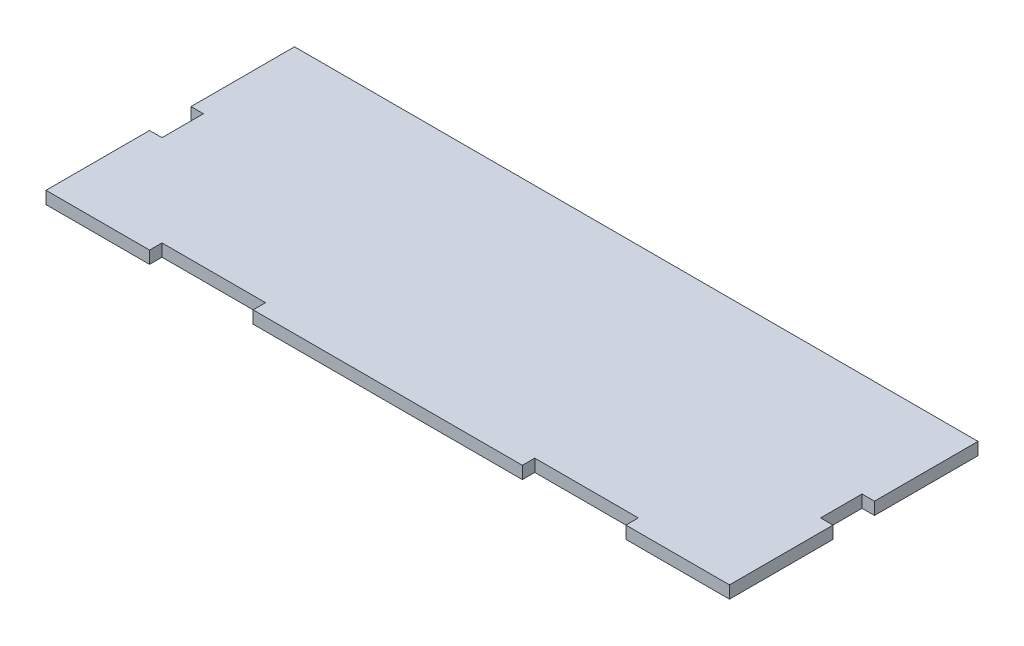
ISO-10303-21;
HEADER;
FILE_DESCRIPTION(('STEP AP214'),'2;1');
FILE_NAME('part.step','',(''),(''),'','','');
FILE_SCHEMA(('AUTOMOTIVE_DESIGN { 1 0 10303 214 1 1 1 1 }'));
ENDSEC;
DATA;
#1=APPLICATION_CONTEXT('core data for automotive mechanical design processes');
#2=APPLICATION_PROTOCOL_DEFINITION('international standard','automotive_design',2000,#1);
#3=PRODUCT_CONTEXT('',#1,'mechanical');
#4=PRODUCT('Part','Part','',(#3));
#5=PRODUCT_RELATED_PRODUCT_CATEGORY('part','',(#4));
#6=PRODUCT_DEFINITION_FORMATION('','',#4);
#7=PRODUCT_DEFINITION_CONTEXT('part definition',#1,'design');
#8=PRODUCT_DEFINITION('design','',#6,#7);
#9=PRODUCT_DEFINITION_SHAPE('','',#8);
#10=(LENGTH_UNIT() NAMED_UNIT(*) SI_UNIT(.MILLI.,.METRE.));
#11=(NAMED_UNIT(*) PLANE_ANGLE_UNIT() SI_UNIT($,.RADIAN.));
#12=(NAMED_UNIT(*) SI_UNIT($,.STERADIAN.) SOLID_ANGLE_UNIT());
#13=UNCERTAINTY_MEASURE_WITH_UNIT(LENGTH_MEASURE(1.E-05),#10,'distance_accuracy_value','');
#14=(GEOMETRIC_REPRESENTATION_CONTEXT(3) GLOBAL_UNCERTAINTY_ASSIGNED_CONTEXT((#13)) GLOBAL_UNIT_ASSIGNED_CONTEXT((#10,
#11,#12)) REPRESENTATION_CONTEXT('',''));
#15=CARTESIAN_POINT('',(0.,0.,0.));
#16=DIRECTION('',(0.,0.,1.));
#17=DIRECTION('',(1.,0.,0.));
#18=AXIS2_PLACEMENT_3D('',#15,#16,#17);
#19=CARTESIAN_POINT('',(82.5,3.,30.));
#20=DIRECTION('',(-1.,0.,0.));
#21=DIRECTION('',(0.,0.,1.));
#22=AXIS2_PLACEMENT_3D('',#19,#20,#21);
#23=PLANE('',#22);
#24=DIRECTION('',(0.,0.,-1.));
#25=VECTOR('',#24,1.);
#26=CARTESIAN_POINT('',(82.5,0.,30.));
#27=LINE('',#26,#25);
#28=CARTESIAN_POINT('',(82.5,0.,30.));
#29=VERTEX_POINT('',#28);
#30=CARTESIAN_POINT('',(82.5,0.,5.));
#31=VERTEX_POINT('',#30);
#32=EDGE_CURVE('E203',#29,#31,#27,.T.);
#33=ORIENTED_EDGE('',*,*,#32,.T.);
#34=DIRECTION('',(0.,-1.,0.));
#35=VECTOR('',#34,1.);
#36=CARTESIAN_POINT('',(82.5,3.,5.));
#37=LINE('',#36,#35);
#38=CARTESIAN_POINT('',(82.5,3.,5.));
#39=VERTEX_POINT('',#38);
#40=EDGE_CURVE('E11',#39,#31,#37,.T.);
#41=ORIENTED_EDGE('',*,*,#40,.F.);
#42=DIRECTION('',(0.,0.,-1.));
#43=VECTOR('',#42,1.);
#44=CARTESIAN_POINT('',(82.5,3.,30.));
#45=LINE('',#44,#43);
#46=CARTESIAN_POINT('',(82.5,3.,30.));
#47=VERTEX_POINT('',#46);
#48=EDGE_CURVE('E241',#47,#39,#45,.T.);
#49=ORIENTED_EDGE('',*,*,#48,.F.);
#50=DIRECTION('',(0.,-1.,0.));
#51=VECTOR('',#50,1.);
#52=CARTESIAN_POINT('',(82.5,3.,30.));
#53=LINE('',#52,#51);
#54=EDGE_CURVE('E199',#47,#29,#53,.T.);
#55=ORIENTED_EDGE('',*,*,#54,.T.);
#56=EDGE_LOOP('',(#33,#41,#49,#55));
#57=FACE_BOUND('',#56,.T.);
#58=ADVANCED_FACE('F35',(#57),#23,.F.);
#59=CARTESIAN_POINT('',(82.5,3.,5.));
#60=DIRECTION('',(0.,0.,1.));
#61=DIRECTION('',(1.,0.,0.));
#62=AXIS2_PLACEMENT_3D('',#59,#60,#61);
#63=PLANE('',#62);
#64=DIRECTION('',(-1.,0.,0.));
#65=VECTOR('',#64,1.);
#66=CARTESIAN_POINT('',(82.5,0.,5.));
#67=LINE('',#66,#65);
#68=CARTESIAN_POINT('',(79.5,0.,5.));
#69=VERTEX_POINT('',#68);
#70=EDGE_CURVE('E206',#31,#69,#67,.T.);
#71=ORIENTED_EDGE('',*,*,#70,.T.);
#72=DIRECTION('',(0.,-1.,0.));
#73=VECTOR('',#72,1.);
#74=CARTESIAN_POINT('',(79.5,3.,5.));
#75=LINE('',#74,#73);
#76=CARTESIAN_POINT('',(79.5,3.,5.));
#77=VERTEX_POINT('',#76);
#78=EDGE_CURVE('E43',#77,#69,#75,.T.);
#79=ORIENTED_EDGE('',*,*,#78,.F.);
#80=DIRECTION('',(-1.,0.,0.));
#81=VECTOR('',#80,1.);
#82=CARTESIAN_POINT('',(82.5,3.,5.));
#83=LINE('',#82,#81);
#84=EDGE_CURVE('E130',#39,#77,#83,.T.);
#85=ORIENTED_EDGE('',*,*,#84,.F.);
#86=ORIENTED_EDGE('',*,*,#40,.T.);
#87=EDGE_LOOP('',(#71,#79,#85,#86));
#88=FACE_BOUND('',#87,.T.);
#89=ADVANCED_FACE('F359',(#88),#63,.F.);
#90=CARTESIAN_POINT('',(79.5,3.,-5.));
#91=DIRECTION('',(-1.,0.,0.));
#92=DIRECTION('',(0.,0.,1.));
#93=AXIS2_PLACEMENT_3D('',#90,#91,#92);
#94=PLANE('',#93);
#95=DIRECTION('',(0.,0.,-1.));
#96=VECTOR('',#95,1.);
#97=CARTESIAN_POINT('',(79.5,0.,-5.));
#98=LINE('',#97,#96);
#99=CARTESIAN_POINT('',(79.5,0.,-5.));
#100=VERTEX_POINT('',#99);
#101=EDGE_CURVE('E208',#69,#100,#98,.T.);
#102=ORIENTED_EDGE('',*,*,#101,.T.);
#103=DIRECTION('',(0.,-1.,0.));
#104=VECTOR('',#103,1.);
#105=CARTESIAN_POINT('',(79.5,3.,-5.));
#106=LINE('',#105,#104);
#107=CARTESIAN_POINT('',(79.5,3.,-5.));
#108=VERTEX_POINT('',#107);
#109=EDGE_CURVE('E284',#108,#100,#106,.T.);
#110=ORIENTED_EDGE('',*,*,#109,.F.);
#111=DIRECTION('',(0.,0.,-1.));
#112=VECTOR('',#111,1.);
#113=CARTESIAN_POINT('',(79.5,3.,-5.));
#114=LINE('',#113,#112);
#115=EDGE_CURVE('E292',#77,#108,#114,.T.);
#116=ORIENTED_EDGE('',*,*,#115,.F.);
#117=ORIENTED_EDGE('',*,*,#78,.T.);
#118=EDGE_LOOP('',(#102,#110,#116,#117));
#119=FACE_BOUND('',#118,.T.);
#120=ADVANCED_FACE('F290',(#119),#94,.F.);
#121=CARTESIAN_POINT('',(82.5,3.,-5.));
#122=DIRECTION('',(0.,0.,-1.));
#123=DIRECTION('',(-1.,0.,0.));
#124=AXIS2_PLACEMENT_3D('',#121,#122,#123);
#125=PLANE('',#124);
#126=DIRECTION('',(1.,0.,0.));
#127=VECTOR('',#126,1.);
#128=CARTESIAN_POINT('',(82.5,0.,-5.));
#129=LINE('',#128,#127);
#130=CARTESIAN_POINT('',(82.5,0.,-5.));
#131=VERTEX_POINT('',#130);
#132=EDGE_CURVE('E210',#100,#131,#129,.T.);
#133=ORIENTED_EDGE('',*,*,#132,.T.);
#134=DIRECTION('',(0.,-1.,0.));
#135=VECTOR('',#134,1.);
#136=CARTESIAN_POINT('',(82.5,3.,-5.));
#137=LINE('',#136,#135);
#138=CARTESIAN_POINT('',(82.5,3.,-5.));
#139=VERTEX_POINT('',#138);
#140=EDGE_CURVE('E281',#139,#131,#137,.T.);
#141=ORIENTED_EDGE('',*,*,#140,.F.);
#142=DIRECTION('',(1.,0.,0.));
#143=VECTOR('',#142,1.);
#144=CARTESIAN_POINT('',(82.5,3.,-5.));
#145=LINE('',#144,#143);
#146=EDGE_CURVE('E310',#108,#139,#145,.T.);
#147=ORIENTED_EDGE('',*,*,#146,.F.);
#148=ORIENTED_EDGE('',*,*,#109,.T.);
#149=EDGE_LOOP('',(#133,#141,#147,#148));
#150=FACE_BOUND('',#149,.T.);
#151=ADVANCED_FACE('F301',(#150),#125,.F.);
#152=CARTESIAN_POINT('',(82.5,3.,-5.));
#153=DIRECTION('',(-1.,0.,0.));
#154=DIRECTION('',(0.,0.,1.));
#155=AXIS2_PLACEMENT_3D('',#152,#153,#154);
#156=PLANE('',#155);
#157=DIRECTION('',(0.,0.,-1.));
#158=VECTOR('',#157,1.);
#159=CARTESIAN_POINT('',(82.5,0.,-5.));
#160=LINE('',#159,#158);
#161=CARTESIAN_POINT('',(82.5,0.,-30.));
#162=VERTEX_POINT('',#161);
#163=EDGE_CURVE('E212',#131,#162,#160,.T.);
#164=ORIENTED_EDGE('',*,*,#163,.T.);
#165=DIRECTION('',(0.,-1.,0.));
#166=VECTOR('',#165,1.);
#167=CARTESIAN_POINT('',(82.5,3.,-30.));
#168=LINE('',#167,#166);
#169=CARTESIAN_POINT('',(82.5,3.,-30.));
#170=VERTEX_POINT('',#169);
#171=EDGE_CURVE('E278',#170,#162,#168,.T.);
#172=ORIENTED_EDGE('',*,*,#171,.F.);
#173=DIRECTION('',(0.,0.,-1.));
#174=VECTOR('',#173,1.);
#175=CARTESIAN_POINT('',(82.5,3.,-5.));
#176=LINE('',#175,#174);
#177=EDGE_CURVE('E307',#139,#170,#176,.T.);
#178=ORIENTED_EDGE('',*,*,#177,.F.);
#179=ORIENTED_EDGE('',*,*,#140,.T.);
#180=EDGE_LOOP('',(#164,#172,#178,#179));
#181=FACE_BOUND('',#180,.T.);
#182=ADVANCED_FACE('F305',(#181),#156,.F.);
#183=CARTESIAN_POINT('',(82.5,3.,-30.));
#184=DIRECTION('',(0.,0.,1.));
#185=DIRECTION('',(1.,0.,0.));
#186=AXIS2_PLACEMENT_3D('',#183,#184,#185);
#187=PLANE('',#186);
#188=DIRECTION('',(-1.,0.,0.));
#189=VECTOR('',#188,1.);
#190=CARTESIAN_POINT('',(82.5,0.,-30.));
#191=LINE('',#190,#189);
#192=CARTESIAN_POINT('',(-82.5,0.,-30.));
#193=VERTEX_POINT('',#192);
#194=EDGE_CURVE('E214',#162,#193,#191,.T.);
#195=ORIENTED_EDGE('',*,*,#194,.T.);
#196=DIRECTION('',(0.,-1.,0.));
#197=VECTOR('',#196,1.);
#198=CARTESIAN_POINT('',(-82.5,3.,-30.));
#199=LINE('',#198,#197);
#200=CARTESIAN_POINT('',(-82.5,3.,-30.));
#201=VERTEX_POINT('',#200);
#202=EDGE_CURVE('E275',#201,#193,#199,.T.);
#203=ORIENTED_EDGE('',*,*,#202,.F.);
#204=DIRECTION('',(-1.,0.,0.));
#205=VECTOR('',#204,1.);
#206=CARTESIAN_POINT('',(82.5,3.,-30.));
#207=LINE('',#206,#205);
#208=EDGE_CURVE('E309',#170,#201,#207,.T.);
#209=ORIENTED_EDGE('',*,*,#208,.F.);
#210=ORIENTED_EDGE('',*,*,#171,.T.);
#211=EDGE_LOOP('',(#195,#203,#209,#210));
#212=FACE_BOUND('',#211,.T.);
#213=ADVANCED_FACE('F372',(#212),#187,.F.);
#214=CARTESIAN_POINT('',(-82.5,3.,-5.));
#215=DIRECTION('',(1.,0.,0.));
#216=DIRECTION('',(0.,0.,-1.));
#217=AXIS2_PLACEMENT_3D('',#214,#215,#216);
#218=PLANE('',#217);
#219=DIRECTION('',(0.,0.,1.));
#220=VECTOR('',#219,1.);
#221=CARTESIAN_POINT('',(-82.5,0.,-5.));
#222=LINE('',#221,#220);
#223=CARTESIAN_POINT('',(-82.5,0.,-5.));
#224=VERTEX_POINT('',#223);
#225=EDGE_CURVE('E216',#193,#224,#222,.T.);
#226=ORIENTED_EDGE('',*,*,#225,.T.);
#227=DIRECTION('',(0.,-1.,0.));
#228=VECTOR('',#227,1.);
#229=CARTESIAN_POINT('',(-82.5,3.,-5.));
#230=LINE('',#229,#228);
#231=CARTESIAN_POINT('',(-82.5,3.,-5.));
#232=VERTEX_POINT('',#231);
#233=EDGE_CURVE('E272',#232,#224,#230,.T.);
#234=ORIENTED_EDGE('',*,*,#233,.F.);
#235=DIRECTION('',(0.,0.,1.));
#236=VECTOR('',#235,1.);
#237=CARTESIAN_POINT('',(-82.5,3.,-5.));
#238=LINE('',#237,#236);
#239=EDGE_CURVE('E312',#201,#232,#238,.T.);
#240=ORIENTED_EDGE('',*,*,#239,.F.);
#241=ORIENTED_EDGE('',*,*,#202,.T.);
#242=EDGE_LOOP('',(#226,#234,#240,#241));
#243=FACE_BOUND('',#242,.T.);
#244=ADVANCED_FACE('F375',(#243),#218,.F.);
#245=CARTESIAN_POINT('',(-82.5,3.,-5.));
#246=DIRECTION('',(0.,0.,-1.));
#247=DIRECTION('',(-1.,0.,0.));
#248=AXIS2_PLACEMENT_3D('',#245,#246,#247);
#249=PLANE('',#248);
#250=DIRECTION('',(1.,0.,0.));
#251=VECTOR('',#250,1.);
#252=CARTESIAN_POINT('',(-82.5,0.,-5.));
#253=LINE('',#252,#251);
#254=CARTESIAN_POINT('',(-79.5,0.,-5.));
#255=VERTEX_POINT('',#254);
#256=EDGE_CURVE('E218',#224,#255,#253,.T.);
#257=ORIENTED_EDGE('',*,*,#256,.T.);
#258=DIRECTION('',(0.,-1.,0.));
#259=VECTOR('',#258,1.);
#260=CARTESIAN_POINT('',(-79.5,3.,-5.));
#261=LINE('',#260,#259);
#262=CARTESIAN_POINT('',(-79.5,3.,-5.));
#263=VERTEX_POINT('',#262);
#264=EDGE_CURVE('E269',#263,#255,#261,.T.);
#265=ORIENTED_EDGE('',*,*,#264,.F.);
#266=DIRECTION('',(1.,0.,0.));
#267=VECTOR('',#266,1.);
#268=CARTESIAN_POINT('',(-82.5,3.,-5.));
#269=LINE('',#268,#267);
#270=EDGE_CURVE('E318',#232,#263,#269,.T.);
#271=ORIENTED_EDGE('',*,*,#270,.F.);
#272=ORIENTED_EDGE('',*,*,#233,.T.);
#273=EDGE_LOOP('',(#257,#265,#271,#272));
#274=FACE_BOUND('',#273,.T.);
#275=ADVANCED_FACE('F379',(#274),#249,.F.);
#276=CARTESIAN_POINT('',(-79.5,3.,-5.));
#277=DIRECTION('',(1.,0.,0.));
#278=DIRECTION('',(0.,0.,-1.));
#279=AXIS2_PLACEMENT_3D('',#276,#277,#278);
#280=PLANE('',#279);
#281=DIRECTION('',(0.,0.,1.));
#282=VECTOR('',#281,1.);
#283=CARTESIAN_POINT('',(-79.5,0.,-5.));
#284=LINE('',#283,#282);
#285=CARTESIAN_POINT('',(-79.5,0.,5.));
#286=VERTEX_POINT('',#285);
#287=EDGE_CURVE('E220',#255,#286,#284,.T.);
#288=ORIENTED_EDGE('',*,*,#287,.T.);
#289=DIRECTION('',(0.,-1.,0.));
#290=VECTOR('',#289,1.);
#291=CARTESIAN_POINT('',(-79.5,3.,5.));
#292=LINE('',#291,#290);
#293=CARTESIAN_POINT('',(-79.5,3.,5.));
#294=VERTEX_POINT('',#293);
#295=EDGE_CURVE('E266',#294,#286,#292,.T.);
#296=ORIENTED_EDGE('',*,*,#295,.F.);
#297=DIRECTION('',(0.,0.,1.));
#298=VECTOR('',#297,1.);
#299=CARTESIAN_POINT('',(-79.5,3.,-5.));
#300=LINE('',#299,#298);
#301=EDGE_CURVE('E320',#263,#294,#300,.T.);
#302=ORIENTED_EDGE('',*,*,#301,.F.);
#303=ORIENTED_EDGE('',*,*,#264,.T.);
#304=EDGE_LOOP('',(#288,#296,#302,#303));
#305=FACE_BOUND('',#304,.T.);
#306=ADVANCED_FACE('F383',(#305),#280,.F.);
#307=CARTESIAN_POINT('',(-82.5,3.,5.));
#308=DIRECTION('',(0.,0.,1.));
#309=DIRECTION('',(1.,0.,0.));
#310=AXIS2_PLACEMENT_3D('',#307,#308,#309);
#311=PLANE('',#310);
#312=DIRECTION('',(-1.,0.,0.));
#313=VECTOR('',#312,1.);
#314=CARTESIAN_POINT('',(-82.5,0.,5.));
#315=LINE('',#314,#313);
#316=CARTESIAN_POINT('',(-82.5,0.,5.));
#317=VERTEX_POINT('',#316);
#318=EDGE_CURVE('E222',#286,#317,#315,.T.);
#319=ORIENTED_EDGE('',*,*,#318,.T.);
#320=DIRECTION('',(0.,-1.,0.));
#321=VECTOR('',#320,1.);
#322=CARTESIAN_POINT('',(-82.5,3.,5.));
#323=LINE('',#322,#321);
#324=CARTESIAN_POINT('',(-82.5,3.,5.));
#325=VERTEX_POINT('',#324);
#326=EDGE_CURVE('E263',#325,#317,#323,.T.);
#327=ORIENTED_EDGE('',*,*,#326,.F.);
#328=DIRECTION('',(-1.,0.,0.));
#329=VECTOR('',#328,1.);
#330=CARTESIAN_POINT('',(-82.5,3.,5.));
#331=LINE('',#330,#329);
#332=EDGE_CURVE('E322',#294,#325,#331,.T.);
#333=ORIENTED_EDGE('',*,*,#332,.F.);
#334=ORIENTED_EDGE('',*,*,#295,.T.);
#335=EDGE_LOOP('',(#319,#327,#333,#334));
#336=FACE_BOUND('',#335,.T.);
#337=ADVANCED_FACE('F387',(#336),#311,.F.);
#338=CARTESIAN_POINT('',(-82.5,3.,30.));
#339=DIRECTION('',(1.,0.,0.));
#340=DIRECTION('',(0.,0.,-1.));
#341=AXIS2_PLACEMENT_3D('',#338,#339,#340);
#342=PLANE('',#341);
#343=DIRECTION('',(0.,0.,1.));
#344=VECTOR('',#343,1.);
#345=CARTESIAN_POINT('',(-82.5,0.,30.));
#346=LINE('',#345,#344);
#347=CARTESIAN_POINT('',(-82.5,0.,30.));
#348=VERTEX_POINT('',#347);
#349=EDGE_CURVE('E224',#317,#348,#346,.T.);
#350=ORIENTED_EDGE('',*,*,#349,.T.);
#351=DIRECTION('',(0.,-1.,0.));
#352=VECTOR('',#351,1.);
#353=CARTESIAN_POINT('',(-82.5,3.,30.));
#354=LINE('',#353,#352);
#355=CARTESIAN_POINT('',(-82.5,3.,30.));
#356=VERTEX_POINT('',#355);
#357=EDGE_CURVE('E260',#356,#348,#354,.T.);
#358=ORIENTED_EDGE('',*,*,#357,.F.);
#359=DIRECTION('',(0.,0.,1.));
#360=VECTOR('',#359,1.);
#361=CARTESIAN_POINT('',(-82.5,3.,30.));
#362=LINE('',#361,#360);
#363=EDGE_CURVE('E324',#325,#356,#362,.T.);
#364=ORIENTED_EDGE('',*,*,#363,.F.);
#365=ORIENTED_EDGE('',*,*,#326,.T.);
#366=EDGE_LOOP('',(#350,#358,#364,#365));
#367=FACE_BOUND('',#366,.T.);
#368=ADVANCED_FACE('F391',(#367),#342,.F.);
#369=CARTESIAN_POINT('',(-57.5,3.,30.));
#370=DIRECTION('',(0.,0.,-1.));
#371=DIRECTION('',(-1.,0.,0.));
#372=AXIS2_PLACEMENT_3D('',#369,#370,#371);
#373=PLANE('',#372);
#374=DIRECTION('',(1.,0.,0.));
#375=VECTOR('',#374,1.);
#376=CARTESIAN_POINT('',(-57.5,0.,30.));
#377=LINE('',#376,#375);
#378=CARTESIAN_POINT('',(-57.5,0.,30.));
#379=VERTEX_POINT('',#378);
#380=EDGE_CURVE('E226',#348,#379,#377,.T.);
#381=ORIENTED_EDGE('',*,*,#380,.T.);
#382=DIRECTION('',(0.,-1.,0.));
#383=VECTOR('',#382,1.);
#384=CARTESIAN_POINT('',(-57.5,3.,30.));
#385=LINE('',#384,#383);
#386=CARTESIAN_POINT('',(-57.5,3.,30.));
#387=VERTEX_POINT('',#386);
#388=EDGE_CURVE('E257',#387,#379,#385,.T.);
#389=ORIENTED_EDGE('',*,*,#388,.F.);
#390=DIRECTION('',(1.,0.,0.));
#391=VECTOR('',#390,1.);
#392=CARTESIAN_POINT('',(-57.5,3.,30.));
#393=LINE('',#392,#391);
#394=EDGE_CURVE('E326',#356,#387,#393,.T.);
#395=ORIENTED_EDGE('',*,*,#394,.F.);
#396=ORIENTED_EDGE('',*,*,#357,.T.);
#397=EDGE_LOOP('',(#381,#389,#395,#396));
#398=FACE_BOUND('',#397,.T.);
#399=ADVANCED_FACE('F395',(#398),#373,.F.);
#400=CARTESIAN_POINT('',(-57.5,3.,30.));
#401=DIRECTION('',(-1.,0.,0.));
#402=DIRECTION('',(0.,0.,1.));
#403=AXIS2_PLACEMENT_3D('',#400,#401,#402);
#404=PLANE('',#403);
#405=DIRECTION('',(0.,0.,-1.));
#406=VECTOR('',#405,1.);
#407=CARTESIAN_POINT('',(-57.5,0.,30.));
#408=LINE('',#407,#406);
#409=CARTESIAN_POINT('',(-57.5,0.,27.));
#410=VERTEX_POINT('',#409);
#411=EDGE_CURVE('E228',#379,#410,#408,.T.);
#412=ORIENTED_EDGE('',*,*,#411,.T.);
#413=DIRECTION('',(0.,-1.,0.));
#414=VECTOR('',#413,1.);
#415=CARTESIAN_POINT('',(-57.5,3.,27.));
#416=LINE('',#415,#414);
#417=CARTESIAN_POINT('',(-57.5,3.,27.));
#418=VERTEX_POINT('',#417);
#419=EDGE_CURVE('E254',#418,#410,#416,.T.);
#420=ORIENTED_EDGE('',*,*,#419,.F.);
#421=DIRECTION('',(0.,0.,-1.));
#422=VECTOR('',#421,1.);
#423=CARTESIAN_POINT('',(-57.5,3.,30.));
#424=LINE('',#423,#422);
#425=EDGE_CURVE('E328',#387,#418,#424,.T.);
#426=ORIENTED_EDGE('',*,*,#425,.F.);
#427=ORIENTED_EDGE('',*,*,#388,.T.);
#428=EDGE_LOOP('',(#412,#420,#426,#427));
#429=FACE_BOUND('',#428,.T.);
#430=ADVANCED_FACE('F399',(#429),#404,.F.);
#431=CARTESIAN_POINT('',(-57.5,3.,27.));
#432=DIRECTION('',(0.,0.,-1.));
#433=DIRECTION('',(-1.,0.,0.));
#434=AXIS2_PLACEMENT_3D('',#431,#432,#433);
#435=PLANE('',#434);
#436=DIRECTION('',(1.,0.,0.));
#437=VECTOR('',#436,1.);
#438=CARTESIAN_POINT('',(-57.5,0.,27.));
#439=LINE('',#438,#437);
#440=CARTESIAN_POINT('',(-32.5,0.,27.));
#441=VERTEX_POINT('',#440);
#442=EDGE_CURVE('E230',#410,#441,#439,.T.);
#443=ORIENTED_EDGE('',*,*,#442,.T.);
#444=DIRECTION('',(0.,-1.,0.));
#445=VECTOR('',#444,1.);
#446=CARTESIAN_POINT('',(-32.5,3.,27.));
#447=LINE('',#446,#445);
#448=CARTESIAN_POINT('',(-32.5,3.,27.));
#449=VERTEX_POINT('',#448);
#450=EDGE_CURVE('E251',#449,#441,#447,.T.);
#451=ORIENTED_EDGE('',*,*,#450,.F.);
#452=DIRECTION('',(1.,0.,0.));
#453=VECTOR('',#452,1.);
#454=CARTESIAN_POINT('',(-57.5,3.,27.));
#455=LINE('',#454,#453);
#456=EDGE_CURVE('E330',#418,#449,#455,.T.);
#457=ORIENTED_EDGE('',*,*,#456,.F.);
#458=ORIENTED_EDGE('',*,*,#419,.T.);
#459=EDGE_LOOP('',(#443,#451,#457,#458));
#460=FACE_BOUND('',#459,.T.);
#461=ADVANCED_FACE('F403',(#460),#435,.F.);
#462=CARTESIAN_POINT('',(-32.5,3.,30.));
#463=DIRECTION('',(1.,0.,0.));
#464=DIRECTION('',(0.,0.,-1.));
#465=AXIS2_PLACEMENT_3D('',#462,#463,#464);
#466=PLANE('',#465);
#467=DIRECTION('',(0.,0.,1.));
#468=VECTOR('',#467,1.);
#469=CARTESIAN_POINT('',(-32.5,0.,30.));
#470=LINE('',#469,#468);
#471=CARTESIAN_POINT('',(-32.5,0.,30.));
#472=VERTEX_POINT('',#471);
#473=EDGE_CURVE('E232',#441,#472,#470,.T.);
#474=ORIENTED_EDGE('',*,*,#473,.T.);
#475=DIRECTION('',(0.,-1.,0.));
#476=VECTOR('',#475,1.);
#477=CARTESIAN_POINT('',(-32.5,3.,30.));
#478=LINE('',#477,#476);
#479=CARTESIAN_POINT('',(-32.5,3.,30.));
#480=VERTEX_POINT('',#479);
#481=EDGE_CURVE('E248',#480,#472,#478,.T.);
#482=ORIENTED_EDGE('',*,*,#481,.F.);
#483=DIRECTION('',(0.,0.,1.));
#484=VECTOR('',#483,1.);
#485=CARTESIAN_POINT('',(-32.5,3.,30.));
#486=LINE('',#485,#484);
#487=EDGE_CURVE('E332',#449,#480,#486,.T.);
#488=ORIENTED_EDGE('',*,*,#487,.F.);
#489=ORIENTED_EDGE('',*,*,#450,.T.);
#490=EDGE_LOOP('',(#474,#482,#488,#489));
#491=FACE_BOUND('',#490,.T.);
#492=ADVANCED_FACE('F407',(#491),#466,.F.);
#493=CARTESIAN_POINT('',(32.5,3.,30.));
#494=DIRECTION('',(0.,0.,-1.));
#495=DIRECTION('',(-1.,0.,0.));
#496=AXIS2_PLACEMENT_3D('',#493,#494,#495);
#497=PLANE('',#496);
#498=DIRECTION('',(1.,0.,0.));
#499=VECTOR('',#498,1.);
#500=CARTESIAN_POINT('',(32.5,0.,30.));
#501=LINE('',#500,#499);
#502=CARTESIAN_POINT('',(32.5,0.,30.));
#503=VERTEX_POINT('',#502);
#504=EDGE_CURVE('E234',#472,#503,#501,.T.);
#505=ORIENTED_EDGE('',*,*,#504,.T.);
#506=DIRECTION('',(0.,-1.,0.));
#507=VECTOR('',#506,1.);
#508=CARTESIAN_POINT('',(32.5,3.,30.));
#509=LINE('',#508,#507);
#510=CARTESIAN_POINT('',(32.5,3.,30.));
#511=VERTEX_POINT('',#510);
#512=EDGE_CURVE('E245',#511,#503,#509,.T.);
#513=ORIENTED_EDGE('',*,*,#512,.F.);
#514=DIRECTION('',(1.,0.,0.));
#515=VECTOR('',#514,1.);
#516=CARTESIAN_POINT('',(32.5,3.,30.));
#517=LINE('',#516,#515);
#518=EDGE_CURVE('E334',#480,#511,#517,.T.);
#519=ORIENTED_EDGE('',*,*,#518,.F.);
#520=ORIENTED_EDGE('',*,*,#481,.T.);
#521=EDGE_LOOP('',(#505,#513,#519,#520));
#522=FACE_BOUND('',#521,.T.);
#523=ADVANCED_FACE('F340',(#522),#497,.F.);
#524=CARTESIAN_POINT('',(32.5,3.,30.));
#525=DIRECTION('',(-1.,0.,0.));
#526=DIRECTION('',(0.,0.,1.));
#527=AXIS2_PLACEMENT_3D('',#524,#525,#526);
#528=PLANE('',#527);
#529=DIRECTION('',(0.,0.,-1.));
#530=VECTOR('',#529,1.);
#531=CARTESIAN_POINT('',(32.5,0.,30.));
#532=LINE('',#531,#530);
#533=CARTESIAN_POINT('',(32.5,0.,27.));
#534=VERTEX_POINT('',#533);
#535=EDGE_CURVE('E236',#503,#534,#532,.T.);
#536=ORIENTED_EDGE('',*,*,#535,.T.);
#537=DIRECTION('',(0.,-1.,0.));
#538=VECTOR('',#537,1.);
#539=CARTESIAN_POINT('',(32.5,3.,27.));
#540=LINE('',#539,#538);
#541=CARTESIAN_POINT('',(32.5,3.,27.));
#542=VERTEX_POINT('',#541);
#543=EDGE_CURVE('E194',#542,#534,#540,.T.);
#544=ORIENTED_EDGE('',*,*,#543,.F.);
#545=DIRECTION('',(0.,0.,-1.));
#546=VECTOR('',#545,1.);
#547=CARTESIAN_POINT('',(32.5,3.,30.));
#548=LINE('',#547,#546);
#549=EDGE_CURVE('E185',#511,#542,#548,.T.);
#550=ORIENTED_EDGE('',*,*,#549,.F.);
#551=ORIENTED_EDGE('',*,*,#512,.T.);
#552=EDGE_LOOP('',(#536,#544,#550,#551));
#553=FACE_BOUND('',#552,.T.);
#554=ADVANCED_FACE('F344',(#553),#528,.F.);
#555=CARTESIAN_POINT('',(32.5,3.,27.));
#556=DIRECTION('',(0.,0.,-1.));
#557=DIRECTION('',(-1.,0.,0.));
#558=AXIS2_PLACEMENT_3D('',#555,#556,#557);
#559=PLANE('',#558);
#560=DIRECTION('',(1.,0.,0.));
#561=VECTOR('',#560,1.);
#562=CARTESIAN_POINT('',(32.5,0.,27.));
#563=LINE('',#562,#561);
#564=CARTESIAN_POINT('',(57.5,0.,27.));
#565=VERTEX_POINT('',#564);
#566=EDGE_CURVE('E193',#534,#565,#563,.T.);
#567=ORIENTED_EDGE('',*,*,#566,.T.);
#568=DIRECTION('',(0.,-1.,0.));
#569=VECTOR('',#568,1.);
#570=CARTESIAN_POINT('',(57.5,3.,27.));
#571=LINE('',#570,#569);
#572=CARTESIAN_POINT('',(57.5,3.,27.));
#573=VERTEX_POINT('',#572);
#574=EDGE_CURVE('E190',#573,#565,#571,.T.);
#575=ORIENTED_EDGE('',*,*,#574,.F.);
#576=DIRECTION('',(1.,0.,0.));
#577=VECTOR('',#576,1.);
#578=CARTESIAN_POINT('',(32.5,3.,27.));
#579=LINE('',#578,#577);
#580=EDGE_CURVE('E179',#542,#573,#579,.T.);
#581=ORIENTED_EDGE('',*,*,#580,.F.);
#582=ORIENTED_EDGE('',*,*,#543,.T.);
#583=EDGE_LOOP('',(#567,#575,#581,#582));
#584=FACE_BOUND('',#583,.T.);
#585=ADVANCED_FACE('F191',(#584),#559,.F.);
#586=CARTESIAN_POINT('',(57.5,3.,30.));
#587=DIRECTION('',(1.,0.,0.));
#588=DIRECTION('',(0.,0.,-1.));
#589=AXIS2_PLACEMENT_3D('',#586,#587,#588);
#590=PLANE('',#589);
#591=DIRECTION('',(0.,0.,1.));
#592=VECTOR('',#591,1.);
#593=CARTESIAN_POINT('',(57.5,0.,30.));
#594=LINE('',#593,#592);
#595=CARTESIAN_POINT('',(57.5,0.,30.));
#596=VERTEX_POINT('',#595);
#597=EDGE_CURVE('E116',#565,#596,#594,.T.);
#598=ORIENTED_EDGE('',*,*,#597,.T.);
#599=DIRECTION('',(0.,-1.,0.));
#600=VECTOR('',#599,1.);
#601=CARTESIAN_POINT('',(57.5,3.,30.));
#602=LINE('',#601,#600);
#603=CARTESIAN_POINT('',(57.5,3.,30.));
#604=VERTEX_POINT('',#603);
#605=EDGE_CURVE('E195',#604,#596,#602,.T.);
#606=ORIENTED_EDGE('',*,*,#605,.F.);
#607=DIRECTION('',(0.,0.,1.));
#608=VECTOR('',#607,1.);
#609=CARTESIAN_POINT('',(57.5,3.,30.));
#610=LINE('',#609,#608);
#611=EDGE_CURVE('E183',#573,#604,#610,.T.);
#612=ORIENTED_EDGE('',*,*,#611,.F.);
#613=ORIENTED_EDGE('',*,*,#574,.T.);
#614=EDGE_LOOP('',(#598,#606,#612,#613));
#615=FACE_BOUND('',#614,.T.);
#616=ADVANCED_FACE('F197',(#615),#590,.F.);
#617=CARTESIAN_POINT('',(82.5,3.,30.));
#618=DIRECTION('',(0.,0.,-1.));
#619=DIRECTION('',(-1.,0.,0.));
#620=AXIS2_PLACEMENT_3D('',#617,#618,#619);
#621=PLANE('',#620);
#622=DIRECTION('',(1.,0.,0.));
#623=VECTOR('',#622,1.);
#624=CARTESIAN_POINT('',(82.5,0.,30.));
#625=LINE('',#624,#623);
#626=EDGE_CURVE('E122',#596,#29,#625,.T.);
#627=ORIENTED_EDGE('',*,*,#626,.T.);
#628=ORIENTED_EDGE('',*,*,#54,.F.);
#629=DIRECTION('',(1.,0.,0.));
#630=VECTOR('',#629,1.);
#631=CARTESIAN_POINT('',(82.5,3.,30.));
#632=LINE('',#631,#630);
#633=EDGE_CURVE('E51',#604,#47,#632,.T.);
#634=ORIENTED_EDGE('',*,*,#633,.F.);
#635=ORIENTED_EDGE('',*,*,#605,.T.);
#636=EDGE_LOOP('',(#627,#628,#634,#635));
#637=FACE_BOUND('',#636,.T.);
#638=ADVANCED_FACE('F348',(#637),#621,.F.);
#639=CARTESIAN_POINT('',(0.,3.,0.));
#640=DIRECTION('',(0.,1.,0.));
#641=DIRECTION('',(0.,0.,1.));
#642=AXIS2_PLACEMENT_3D('',#639,#640,#641);
#643=PLANE('',#642);
#644=ORIENTED_EDGE('',*,*,#48,.T.);
#645=ORIENTED_EDGE('',*,*,#84,.T.);
#646=ORIENTED_EDGE('',*,*,#115,.T.);
#647=ORIENTED_EDGE('',*,*,#146,.T.);
#648=ORIENTED_EDGE('',*,*,#177,.T.);
#649=ORIENTED_EDGE('',*,*,#208,.T.);
#650=ORIENTED_EDGE('',*,*,#239,.T.);
#651=ORIENTED_EDGE('',*,*,#270,.T.);
#652=ORIENTED_EDGE('',*,*,#301,.T.);
#653=ORIENTED_EDGE('',*,*,#332,.T.);
#654=ORIENTED_EDGE('',*,*,#363,.T.);
#655=ORIENTED_EDGE('',*,*,#394,.T.);
#656=ORIENTED_EDGE('',*,*,#425,.T.);
#657=ORIENTED_EDGE('',*,*,#456,.T.);
#658=ORIENTED_EDGE('',*,*,#487,.T.);
#659=ORIENTED_EDGE('',*,*,#518,.T.);
#660=ORIENTED_EDGE('',*,*,#549,.T.);
#661=ORIENTED_EDGE('',*,*,#580,.T.);
#662=ORIENTED_EDGE('',*,*,#611,.T.);
#663=ORIENTED_EDGE('',*,*,#633,.T.);
#664=EDGE_LOOP('',(#644,#645,#646,#647,#648,#649,#650,#651,#652,#653,#654,#655,#656,#657,#658,
#659,#660,#661,#662,#663));
#665=FACE_BOUND('',#664,.T.);
#666=ADVANCED_FACE('F181',(#665),#643,.T.);
#667=CARTESIAN_POINT('',(0.,0.,0.));
#668=DIRECTION('',(0.,1.,0.));
#669=DIRECTION('',(0.,0.,1.));
#670=AXIS2_PLACEMENT_3D('',#667,#668,#669);
#671=PLANE('',#670);
#672=ORIENTED_EDGE('',*,*,#32,.F.);
#673=ORIENTED_EDGE('',*,*,#626,.F.);
#674=ORIENTED_EDGE('',*,*,#597,.F.);
#675=ORIENTED_EDGE('',*,*,#566,.F.);
#676=ORIENTED_EDGE('',*,*,#535,.F.);
#677=ORIENTED_EDGE('',*,*,#504,.F.);
#678=ORIENTED_EDGE('',*,*,#473,.F.);
#679=ORIENTED_EDGE('',*,*,#442,.F.);
#680=ORIENTED_EDGE('',*,*,#411,.F.);
#681=ORIENTED_EDGE('',*,*,#380,.F.);
#682=ORIENTED_EDGE('',*,*,#349,.F.);
#683=ORIENTED_EDGE('',*,*,#318,.F.);
#684=ORIENTED_EDGE('',*,*,#287,.F.);
#685=ORIENTED_EDGE('',*,*,#256,.F.);
#686=ORIENTED_EDGE('',*,*,#225,.F.);
#687=ORIENTED_EDGE('',*,*,#194,.F.);
#688=ORIENTED_EDGE('',*,*,#163,.F.);
#689=ORIENTED_EDGE('',*,*,#132,.F.);
#690=ORIENTED_EDGE('',*,*,#101,.F.);
#691=ORIENTED_EDGE('',*,*,#70,.F.);
#692=EDGE_LOOP('',(#672,#673,#674,#675,#676,#677,#678,#679,#680,#681,#682,#683,#684,#685,#686,
#687,#688,#689,#690,#691));
#693=FACE_BOUND('',#692,.T.);
#694=ADVANCED_FACE('F296',(#693),#671,.F.);
#695=CLOSED_SHELL('',(#58,#89,#120,#151,#182,#213,#244,#275,#306,#337,#368,#399,#430,#461,#492,
#523,#554,#585,#616,#638,#666,#694));
#696=MANIFOLD_SOLID_BREP('B2',#695);
#697=ADVANCED_BREP_SHAPE_REPRESENTATION('',(#18,#696),#14);
#698=SHAPE_DEFINITION_REPRESENTATION(#9,#697);
ENDSEC;
END-ISO-10303-21;
